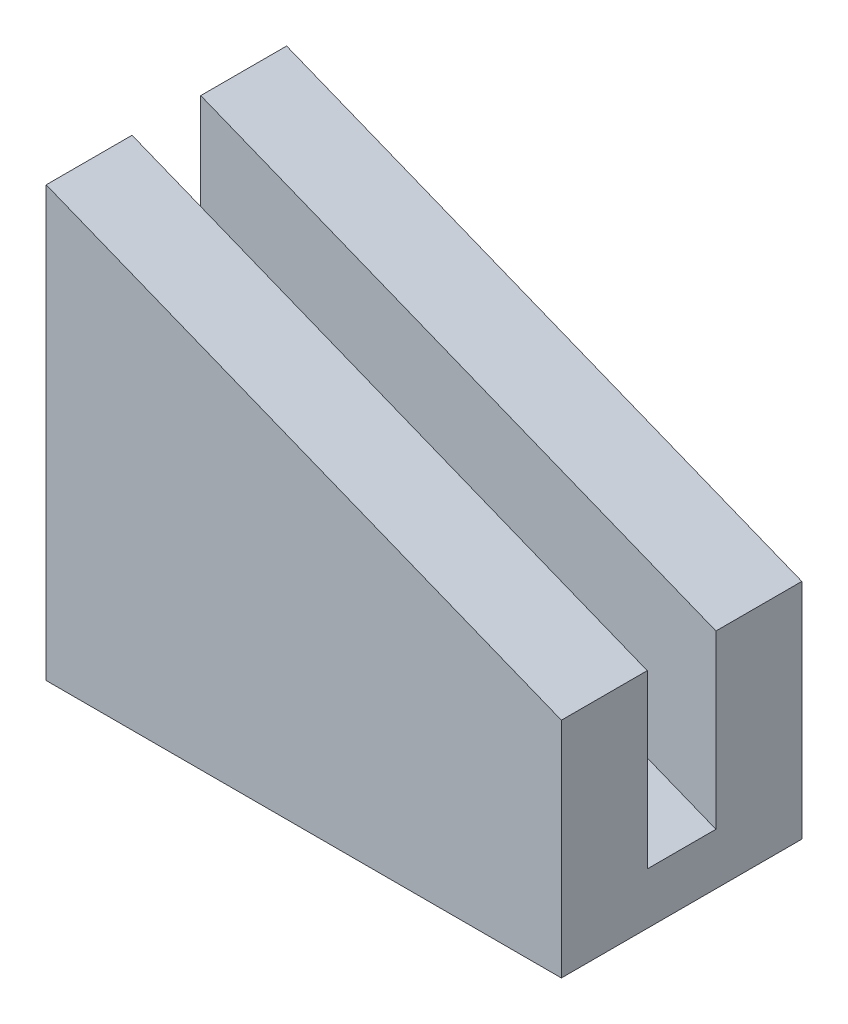
ISO-10303-21;
HEADER;
FILE_DESCRIPTION(('STEP AP214'),'2;1');
FILE_NAME('part.step','',(''),(''),'','','');
FILE_SCHEMA(('AUTOMOTIVE_DESIGN { 1 0 10303 214 1 1 1 1 }'));
ENDSEC;
DATA;
#1=APPLICATION_CONTEXT('core data for automotive mechanical design processes');
#2=APPLICATION_PROTOCOL_DEFINITION('international standard','automotive_design',2000,#1);
#3=PRODUCT_CONTEXT('',#1,'mechanical');
#4=PRODUCT('Part','Part','',(#3));
#5=PRODUCT_RELATED_PRODUCT_CATEGORY('part','',(#4));
#6=PRODUCT_DEFINITION_FORMATION('','',#4);
#7=PRODUCT_DEFINITION_CONTEXT('part definition',#1,'design');
#8=PRODUCT_DEFINITION('design','',#6,#7);
#9=PRODUCT_DEFINITION_SHAPE('','',#8);
#10=(LENGTH_UNIT() NAMED_UNIT(*) SI_UNIT(.MILLI.,.METRE.));
#11=(NAMED_UNIT(*) PLANE_ANGLE_UNIT() SI_UNIT($,.RADIAN.));
#12=(NAMED_UNIT(*) SI_UNIT($,.STERADIAN.) SOLID_ANGLE_UNIT());
#13=UNCERTAINTY_MEASURE_WITH_UNIT(LENGTH_MEASURE(1.E-05),#10,'distance_accuracy_value','');
#14=(GEOMETRIC_REPRESENTATION_CONTEXT(3) GLOBAL_UNCERTAINTY_ASSIGNED_CONTEXT((#13)) GLOBAL_UNIT_ASSIGNED_CONTEXT((#10,
#11,#12)) REPRESENTATION_CONTEXT('',''));
#15=CARTESIAN_POINT('',(0.,0.,0.));
#16=DIRECTION('',(0.,0.,1.));
#17=DIRECTION('',(1.,0.,0.));
#18=AXIS2_PLACEMENT_3D('',#15,#16,#17);
#19=CARTESIAN_POINT('',(38.1,63.5,-17.78));
#20=DIRECTION('',(-1.,0.,0.));
#21=DIRECTION('',(0.,0.,1.));
#22=AXIS2_PLACEMENT_3D('',#19,#20,#21);
#23=PLANE('',#22);
#24=DIRECTION('',(0.,-1.,0.));
#25=VECTOR('',#24,1.);
#26=CARTESIAN_POINT('',(38.1,63.5,-17.78));
#27=LINE('',#26,#25);
#28=CARTESIAN_POINT('',(38.1,33.02,-17.78));
#29=VERTEX_POINT('',#28);
#30=CARTESIAN_POINT('',(38.1,0.,-17.78));
#31=VERTEX_POINT('',#30);
#32=EDGE_CURVE('E42',#29,#31,#27,.T.);
#33=ORIENTED_EDGE('',*,*,#32,.F.);
#34=DIRECTION('',(0.,0.,-1.));
#35=VECTOR('',#34,1.);
#36=CARTESIAN_POINT('',(38.1,33.02,17.78));
#37=LINE('',#36,#35);
#38=CARTESIAN_POINT('',(38.1,33.02,-5.08));
#39=VERTEX_POINT('',#38);
#40=EDGE_CURVE('E99',#39,#29,#37,.T.);
#41=ORIENTED_EDGE('',*,*,#40,.F.);
#42=DIRECTION('',(0.,1.,0.));
#43=VECTOR('',#42,1.);
#44=CARTESIAN_POINT('',(38.1,38.1,-5.08));
#45=LINE('',#44,#43);
#46=CARTESIAN_POINT('',(38.1,7.62,-5.08));
#47=VERTEX_POINT('',#46);
#48=EDGE_CURVE('E134',#47,#39,#45,.T.);
#49=ORIENTED_EDGE('',*,*,#48,.F.);
#50=DIRECTION('',(0.,0.,-1.));
#51=VECTOR('',#50,1.);
#52=CARTESIAN_POINT('',(38.1,7.62,87.1499116607298));
#53=LINE('',#52,#51);
#54=CARTESIAN_POINT('',(38.1,7.62,5.08));
#55=VERTEX_POINT('',#54);
#56=EDGE_CURVE('E147',#55,#47,#53,.T.);
#57=ORIENTED_EDGE('',*,*,#56,.F.);
#58=DIRECTION('',(0.,1.,0.));
#59=VECTOR('',#58,1.);
#60=CARTESIAN_POINT('',(38.1,38.1,5.08));
#61=LINE('',#60,#59);
#62=CARTESIAN_POINT('',(38.1,33.02,5.08));
#63=VERTEX_POINT('',#62);
#64=EDGE_CURVE('E132',#55,#63,#61,.T.);
#65=ORIENTED_EDGE('',*,*,#64,.T.);
#66=CARTESIAN_POINT('',(38.1,33.02,17.78));
#67=VERTEX_POINT('',#66);
#68=EDGE_CURVE('E49',#67,#63,#37,.T.);
#69=ORIENTED_EDGE('',*,*,#68,.F.);
#70=DIRECTION('',(0.,-1.,0.));
#71=VECTOR('',#70,1.);
#72=CARTESIAN_POINT('',(38.1,63.5,17.78));
#73=LINE('',#72,#71);
#74=CARTESIAN_POINT('',(38.1,0.,17.78));
#75=VERTEX_POINT('',#74);
#76=EDGE_CURVE('E56',#67,#75,#73,.T.);
#77=ORIENTED_EDGE('',*,*,#76,.T.);
#78=DIRECTION('',(0.,0.,-1.));
#79=VECTOR('',#78,1.);
#80=CARTESIAN_POINT('',(38.1,0.,-17.78));
#81=LINE('',#80,#79);
#82=EDGE_CURVE('E116',#75,#31,#81,.T.);
#83=ORIENTED_EDGE('',*,*,#82,.T.);
#84=EDGE_LOOP('',(#33,#41,#49,#57,#65,#69,#77,#83));
#85=FACE_BOUND('',#84,.T.);
#86=ADVANCED_FACE('F35',(#85),#23,.F.);
#87=CARTESIAN_POINT('',(-38.1,63.5,-17.78));
#88=DIRECTION('',(0.,0.,1.));
#89=DIRECTION('',(1.,0.,0.));
#90=AXIS2_PLACEMENT_3D('',#87,#88,#89);
#91=PLANE('',#90);
#92=DIRECTION('',(0.,-1.,0.));
#93=VECTOR('',#92,1.);
#94=CARTESIAN_POINT('',(-38.1,63.5,-17.78));
#95=LINE('',#94,#93);
#96=CARTESIAN_POINT('',(-38.1,63.5,-17.78));
#97=VERTEX_POINT('',#96);
#98=CARTESIAN_POINT('',(-38.1,0.,-17.78));
#99=VERTEX_POINT('',#98);
#100=EDGE_CURVE('E112',#97,#99,#95,.T.);
#101=ORIENTED_EDGE('',*,*,#100,.F.);
#102=DIRECTION('',(-0.928476690885259,0.371390676354104,0.));
#103=VECTOR('',#102,1.);
#104=CARTESIAN_POINT('',(-38.1,63.5,-17.78));
#105=LINE('',#104,#103);
#106=EDGE_CURVE('E102',#29,#97,#105,.T.);
#107=ORIENTED_EDGE('',*,*,#106,.F.);
#108=ORIENTED_EDGE('',*,*,#32,.T.);
#109=DIRECTION('',(-1.,0.,0.));
#110=VECTOR('',#109,1.);
#111=CARTESIAN_POINT('',(-38.1,0.,-17.78));
#112=LINE('',#111,#110);
#113=EDGE_CURVE('E129',#31,#99,#112,.T.);
#114=ORIENTED_EDGE('',*,*,#113,.T.);
#115=EDGE_LOOP('',(#101,#107,#108,#114));
#116=FACE_BOUND('',#115,.T.);
#117=ADVANCED_FACE('F109',(#116),#91,.F.);
#118=CARTESIAN_POINT('',(-38.1,63.5,-17.78));
#119=DIRECTION('',(1.,0.,0.));
#120=DIRECTION('',(0.,0.,-1.));
#121=AXIS2_PLACEMENT_3D('',#118,#119,#120);
#122=PLANE('',#121);
#123=DIRECTION('',(0.,0.,1.));
#124=VECTOR('',#123,1.);
#125=CARTESIAN_POINT('',(-38.1,63.5,-17.78));
#126=LINE('',#125,#124);
#127=CARTESIAN_POINT('',(-38.1,63.5,5.08));
#128=VERTEX_POINT('',#127);
#129=CARTESIAN_POINT('',(-38.1,63.5,17.78));
#130=VERTEX_POINT('',#129);
#131=EDGE_CURVE('E126',#128,#130,#126,.T.);
#132=ORIENTED_EDGE('',*,*,#131,.F.);
#133=DIRECTION('',(0.,1.,0.));
#134=VECTOR('',#133,1.);
#135=CARTESIAN_POINT('',(-38.1,38.1,5.08));
#136=LINE('',#135,#134);
#137=CARTESIAN_POINT('',(-38.1,38.1,5.08));
#138=VERTEX_POINT('',#137);
#139=EDGE_CURVE('E140',#138,#128,#136,.T.);
#140=ORIENTED_EDGE('',*,*,#139,.F.);
#141=DIRECTION('',(0.,0.,1.));
#142=VECTOR('',#141,1.);
#143=CARTESIAN_POINT('',(-38.1,38.1,-5.08));
#144=LINE('',#143,#142);
#145=CARTESIAN_POINT('',(-38.1,38.1,-5.08));
#146=VERTEX_POINT('',#145);
#147=EDGE_CURVE('E137',#146,#138,#144,.T.);
#148=ORIENTED_EDGE('',*,*,#147,.F.);
#149=DIRECTION('',(0.,1.,0.));
#150=VECTOR('',#149,1.);
#151=CARTESIAN_POINT('',(-38.1,38.1,-5.08));
#152=LINE('',#151,#150);
#153=CARTESIAN_POINT('',(-38.1,63.5,-5.08));
#154=VERTEX_POINT('',#153);
#155=EDGE_CURVE('E136',#146,#154,#152,.T.);
#156=ORIENTED_EDGE('',*,*,#155,.T.);
#157=EDGE_CURVE('E123',#97,#154,#126,.T.);
#158=ORIENTED_EDGE('',*,*,#157,.F.);
#159=ORIENTED_EDGE('',*,*,#100,.T.);
#160=DIRECTION('',(0.,0.,1.));
#161=VECTOR('',#160,1.);
#162=CARTESIAN_POINT('',(-38.1,0.,-17.78));
#163=LINE('',#162,#161);
#164=CARTESIAN_POINT('',(-38.1,0.,17.78));
#165=VERTEX_POINT('',#164);
#166=EDGE_CURVE('E127',#99,#165,#163,.T.);
#167=ORIENTED_EDGE('',*,*,#166,.T.);
#168=DIRECTION('',(0.,-1.,0.));
#169=VECTOR('',#168,1.);
#170=CARTESIAN_POINT('',(-38.1,63.5,17.78));
#171=LINE('',#170,#169);
#172=EDGE_CURVE('E117',#130,#165,#171,.T.);
#173=ORIENTED_EDGE('',*,*,#172,.F.);
#174=EDGE_LOOP('',(#132,#140,#148,#156,#158,#159,#167,#173));
#175=FACE_BOUND('',#174,.T.);
#176=ADVANCED_FACE('F164',(#175),#122,.F.);
#177=CARTESIAN_POINT('',(-38.1,63.5,17.78));
#178=DIRECTION('',(0.,0.,-1.));
#179=DIRECTION('',(-1.,0.,0.));
#180=AXIS2_PLACEMENT_3D('',#177,#178,#179);
#181=PLANE('',#180);
#182=ORIENTED_EDGE('',*,*,#76,.F.);
#183=DIRECTION('',(-0.928476690885259,0.371390676354104,0.));
#184=VECTOR('',#183,1.);
#185=CARTESIAN_POINT('',(-38.1,63.5,17.78));
#186=LINE('',#185,#184);
#187=EDGE_CURVE('E106',#67,#130,#186,.T.);
#188=ORIENTED_EDGE('',*,*,#187,.T.);
#189=ORIENTED_EDGE('',*,*,#172,.T.);
#190=DIRECTION('',(1.,0.,0.));
#191=VECTOR('',#190,1.);
#192=CARTESIAN_POINT('',(-38.1,0.,17.78));
#193=LINE('',#192,#191);
#194=EDGE_CURVE('E124',#165,#75,#193,.T.);
#195=ORIENTED_EDGE('',*,*,#194,.T.);
#196=EDGE_LOOP('',(#182,#188,#189,#195));
#197=FACE_BOUND('',#196,.T.);
#198=ADVANCED_FACE('F160',(#197),#181,.F.);
#199=CARTESIAN_POINT('',(0.,0.,0.));
#200=DIRECTION('',(0.,1.,0.));
#201=DIRECTION('',(0.,0.,1.));
#202=AXIS2_PLACEMENT_3D('',#199,#200,#201);
#203=PLANE('',#202);
#204=ORIENTED_EDGE('',*,*,#82,.F.);
#205=ORIENTED_EDGE('',*,*,#194,.F.);
#206=ORIENTED_EDGE('',*,*,#166,.F.);
#207=ORIENTED_EDGE('',*,*,#113,.F.);
#208=EDGE_LOOP('',(#204,#205,#206,#207));
#209=FACE_BOUND('',#208,.T.);
#210=ADVANCED_FACE('F168',(#209),#203,.F.);
#211=CARTESIAN_POINT('',(-38.1,38.1,5.08));
#212=DIRECTION('',(0.,0.,1.));
#213=DIRECTION('',(1.,0.,0.));
#214=AXIS2_PLACEMENT_3D('',#211,#212,#213);
#215=PLANE('',#214);
#216=ORIENTED_EDGE('',*,*,#139,.T.);
#217=DIRECTION('',(0.928476690885259,-0.371390676354104,0.));
#218=VECTOR('',#217,1.);
#219=CARTESIAN_POINT('',(-29.3413793103448,59.9965517241379,5.08));
#220=LINE('',#219,#218);
#221=EDGE_CURVE('E155',#128,#63,#220,.T.);
#222=ORIENTED_EDGE('',*,*,#221,.T.);
#223=ORIENTED_EDGE('',*,*,#64,.F.);
#224=DIRECTION('',(0.92847669088526,-0.371390676354104,0.));
#225=VECTOR('',#224,1.);
#226=CARTESIAN_POINT('',(38.1,7.62,5.08));
#227=LINE('',#226,#225);
#228=EDGE_CURVE('E146',#138,#55,#227,.T.);
#229=ORIENTED_EDGE('',*,*,#228,.F.);
#230=EDGE_LOOP('',(#216,#222,#223,#229));
#231=FACE_BOUND('',#230,.T.);
#232=ADVANCED_FACE('F170',(#231),#215,.F.);
#233=CARTESIAN_POINT('',(-38.1,38.1,-5.08));
#234=DIRECTION('',(0.,0.,-1.));
#235=DIRECTION('',(-1.,0.,0.));
#236=AXIS2_PLACEMENT_3D('',#233,#234,#235);
#237=PLANE('',#236);
#238=ORIENTED_EDGE('',*,*,#48,.T.);
#239=DIRECTION('',(-0.928476690885259,0.371390676354104,0.));
#240=VECTOR('',#239,1.);
#241=CARTESIAN_POINT('',(-29.3413793103448,59.9965517241379,-5.08));
#242=LINE('',#241,#240);
#243=EDGE_CURVE('E11',#39,#154,#242,.T.);
#244=ORIENTED_EDGE('',*,*,#243,.T.);
#245=ORIENTED_EDGE('',*,*,#155,.F.);
#246=DIRECTION('',(0.928476690885259,-0.371390676354104,0.));
#247=VECTOR('',#246,1.);
#248=CARTESIAN_POINT('',(38.1,7.62,-5.08));
#249=LINE('',#248,#247);
#250=EDGE_CURVE('E150',#146,#47,#249,.T.);
#251=ORIENTED_EDGE('',*,*,#250,.T.);
#252=EDGE_LOOP('',(#238,#244,#245,#251));
#253=FACE_BOUND('',#252,.T.);
#254=ADVANCED_FACE('F176',(#253),#237,.F.);
#255=CARTESIAN_POINT('',(38.1,7.62,87.1499116607298));
#256=DIRECTION('',(0.371390676354104,0.928476690885259,0.));
#257=DIRECTION('',(-0.92847669088526,0.371390676354104,0.));
#258=AXIS2_PLACEMENT_3D('',#255,#256,#257);
#259=PLANE('',#258);
#260=ORIENTED_EDGE('',*,*,#228,.T.);
#261=ORIENTED_EDGE('',*,*,#56,.T.);
#262=ORIENTED_EDGE('',*,*,#250,.F.);
#263=ORIENTED_EDGE('',*,*,#147,.T.);
#264=EDGE_LOOP('',(#260,#261,#262,#263));
#265=FACE_BOUND('',#264,.T.);
#266=ADVANCED_FACE('F213',(#265),#259,.T.);
#267=CARTESIAN_POINT('',(-38.1,63.5,17.78));
#268=DIRECTION('',(-0.371390676354104,-0.928476690885259,0.));
#269=DIRECTION('',(0.928476690885259,-0.371390676354104,0.));
#270=AXIS2_PLACEMENT_3D('',#267,#268,#269);
#271=PLANE('',#270);
#272=ORIENTED_EDGE('',*,*,#40,.T.);
#273=ORIENTED_EDGE('',*,*,#106,.T.);
#274=ORIENTED_EDGE('',*,*,#157,.T.);
#275=ORIENTED_EDGE('',*,*,#243,.F.);
#276=EDGE_LOOP('',(#272,#273,#274,#275));
#277=FACE_BOUND('',#276,.T.);
#278=ADVANCED_FACE('F101',(#277),#271,.F.);
#279=ORIENTED_EDGE('',*,*,#131,.T.);
#280=ORIENTED_EDGE('',*,*,#187,.F.);
#281=ORIENTED_EDGE('',*,*,#68,.T.);
#282=ORIENTED_EDGE('',*,*,#221,.F.);
#283=EDGE_LOOP('',(#279,#280,#281,#282));
#284=FACE_BOUND('',#283,.T.);
#285=ADVANCED_FACE('F224',(#284),#271,.F.);
#286=CLOSED_SHELL('',(#86,#117,#176,#198,#210,#232,#254,#266,#278,#285));
#287=MANIFOLD_SOLID_BREP('B2',#286);
#288=ADVANCED_BREP_SHAPE_REPRESENTATION('',(#18,#287),#14);
#289=SHAPE_DEFINITION_REPRESENTATION(#9,#288);
ENDSEC;
END-ISO-10303-21;
